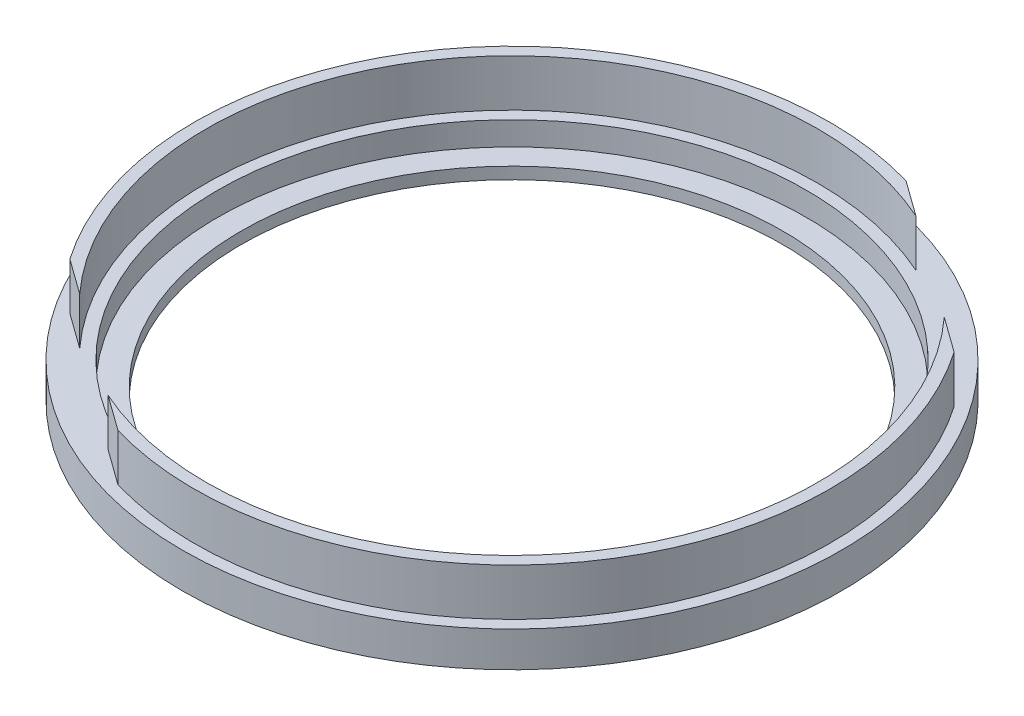
ISO-10303-21;
HEADER;
FILE_DESCRIPTION(('STEP AP214'),'2;1');
FILE_NAME('part.step','',(''),(''),'','','');
FILE_SCHEMA(('AUTOMOTIVE_DESIGN { 1 0 10303 214 1 1 1 1 }'));
ENDSEC;
DATA;
#1=APPLICATION_CONTEXT('core data for automotive mechanical design processes');
#2=APPLICATION_PROTOCOL_DEFINITION('international standard','automotive_design',2000,#1);
#3=PRODUCT_CONTEXT('',#1,'mechanical');
#4=PRODUCT('Part','Part','',(#3));
#5=PRODUCT_RELATED_PRODUCT_CATEGORY('part','',(#4));
#6=PRODUCT_DEFINITION_FORMATION('','',#4);
#7=PRODUCT_DEFINITION_CONTEXT('part definition',#1,'design');
#8=PRODUCT_DEFINITION('design','',#6,#7);
#9=PRODUCT_DEFINITION_SHAPE('','',#8);
#10=(LENGTH_UNIT() NAMED_UNIT(*) SI_UNIT(.MILLI.,.METRE.));
#11=(NAMED_UNIT(*) PLANE_ANGLE_UNIT() SI_UNIT($,.RADIAN.));
#12=(NAMED_UNIT(*) SI_UNIT($,.STERADIAN.) SOLID_ANGLE_UNIT());
#13=UNCERTAINTY_MEASURE_WITH_UNIT(LENGTH_MEASURE(1.E-05),#10,'distance_accuracy_value','');
#14=(GEOMETRIC_REPRESENTATION_CONTEXT(3) GLOBAL_UNCERTAINTY_ASSIGNED_CONTEXT((#13)) GLOBAL_UNIT_ASSIGNED_CONTEXT((#10,
#11,#12)) REPRESENTATION_CONTEXT('',''));
#15=CARTESIAN_POINT('',(0.,0.,0.));
#16=DIRECTION('',(0.,0.,1.));
#17=DIRECTION('',(1.,0.,0.));
#18=AXIS2_PLACEMENT_3D('',#15,#16,#17);
#19=CARTESIAN_POINT('',(-49.2601499183251,7.,-37.6292811876095));
#20=DIRECTION('',(0.,1.,0.));
#21=DIRECTION('',(0.,0.,1.));
#22=AXIS2_PLACEMENT_3D('',#19,#20,#21);
#23=PLANE('',#22);
#24=DIRECTION('',(-0.811044741779512,0.,-0.584984125281878));
#25=VECTOR('',#24,1.);
#26=CARTESIAN_POINT('',(-71.4689323117501,7.,-22.274477880452));
#27=LINE('',#26,#25);
#28=CARTESIAN_POINT('',(-56.8214642752121,7.,-11.7096645778613));
#29=VERTEX_POINT('',#28);
#30=CARTESIAN_POINT('',(-59.812298503221,7.,-13.8668705303912));
#31=VERTEX_POINT('',#30);
#32=EDGE_CURVE('E148',#29,#31,#27,.T.);
#33=ORIENTED_EDGE('',*,*,#32,.F.);
#34=CARTESIAN_POINT('',(-49.2601499183251,7.,-37.6292811876095));
#35=DIRECTION('',(0.,1.,0.));
#36=DIRECTION('',(0.,0.,1.));
#37=AXIS2_PLACEMENT_3D('',#34,#35,#36);
#38=CIRCLE('',#37,27.);
#39=CARTESIAN_POINT('',(-27.0513675249,7.,-52.9840844947669));
#40=VERTEX_POINT('',#39);
#41=EDGE_CURVE('E116',#29,#40,#38,.T.);
#42=ORIENTED_EDGE('',*,*,#41,.T.);
#43=DIRECTION('',(0.811044741779513,0.,0.584984125281877));
#44=VECTOR('',#43,1.);
#45=CARTESIAN_POINT('',(-41.698835561438,7.,-63.5488977973576));
#46=LINE('',#45,#44);
#47=CARTESIAN_POINT('',(-30.0422017529089,7.,-55.1412904472969));
#48=VERTEX_POINT('',#47);
#49=EDGE_CURVE('E146',#48,#40,#46,.T.);
#50=ORIENTED_EDGE('',*,*,#49,.F.);
#51=CARTESIAN_POINT('',(-49.2601499183251,7.,-37.6292811876095));
#52=DIRECTION('',(0.,1.,0.));
#53=DIRECTION('',(0.,0.,1.));
#54=AXIS2_PLACEMENT_3D('',#51,#52,#53);
#55=CIRCLE('',#54,26.);
#56=EDGE_CURVE('E127',#31,#48,#55,.T.);
#57=ORIENTED_EDGE('',*,*,#56,.F.);
#58=EDGE_LOOP('',(#33,#42,#50,#57));
#59=FACE_BOUND('',#58,.T.);
#60=ADVANCED_FACE('F35',(#59),#23,.T.);
#61=CARTESIAN_POINT('',(-49.2601499183251,7.,-37.6292811876095));
#62=DIRECTION('',(0.,-1.,0.));
#63=DIRECTION('',(0.,0.,-1.));
#64=AXIS2_PLACEMENT_3D('',#61,#62,#63);
#65=CYLINDRICAL_SURFACE('',#64,27.);
#66=CARTESIAN_POINT('',(-49.2601499183251,3.,-37.6292811876095));
#67=DIRECTION('',(0.,1.,0.));
#68=DIRECTION('',(0.,0.,1.));
#69=AXIS2_PLACEMENT_3D('',#66,#67,#68);
#70=CIRCLE('',#69,27.);
#71=CARTESIAN_POINT('',(-41.698835561438,3.,-63.5488977973576));
#72=VERTEX_POINT('',#71);
#73=CARTESIAN_POINT('',(-71.4689323117501,3.,-22.274477880452));
#74=VERTEX_POINT('',#73);
#75=EDGE_CURVE('E122',#72,#74,#70,.T.);
#76=ORIENTED_EDGE('',*,*,#75,.T.);
#77=DIRECTION('',(0.,1.,0.));
#78=VECTOR('',#77,1.);
#79=CARTESIAN_POINT('',(-71.4689323117501,3.,-22.274477880452));
#80=LINE('',#79,#78);
#81=CARTESIAN_POINT('',(-71.4689323117501,7.,-22.274477880452));
#82=VERTEX_POINT('',#81);
#83=EDGE_CURVE('E117',#74,#82,#80,.T.);
#84=ORIENTED_EDGE('',*,*,#83,.T.);
#85=CARTESIAN_POINT('',(-41.698835561438,7.,-63.5488977973576));
#86=VERTEX_POINT('',#85);
#87=EDGE_CURVE('E135',#86,#82,#38,.T.);
#88=ORIENTED_EDGE('',*,*,#87,.F.);
#89=DIRECTION('',(0.,1.,0.));
#90=VECTOR('',#89,1.);
#91=CARTESIAN_POINT('',(-41.698835561438,3.,-63.5488977973576));
#92=LINE('',#91,#90);
#93=EDGE_CURVE('E157',#72,#86,#92,.T.);
#94=ORIENTED_EDGE('',*,*,#93,.F.);
#95=EDGE_LOOP('',(#76,#84,#88,#94));
#96=FACE_BOUND('',#95,.T.);
#97=ADVANCED_FACE('F197',(#96),#65,.T.);
#98=CARTESIAN_POINT('',(-49.2601499183251,7.,-37.6292811876095));
#99=DIRECTION('',(0.,-1.,0.));
#100=DIRECTION('',(0.,0.,-1.));
#101=AXIS2_PLACEMENT_3D('',#98,#99,#100);
#102=CYLINDRICAL_SURFACE('',#101,26.);
#103=DIRECTION('',(0.,-1.,0.));
#104=VECTOR('',#103,1.);
#105=CARTESIAN_POINT('',(-59.812298503221,7.,-13.8668705303912));
#106=LINE('',#105,#104);
#107=CARTESIAN_POINT('',(-59.812298503221,3.,-13.8668705303912));
#108=VERTEX_POINT('',#107);
#109=EDGE_CURVE('E105',#31,#108,#106,.T.);
#110=ORIENTED_EDGE('',*,*,#109,.F.);
#111=ORIENTED_EDGE('',*,*,#56,.T.);
#112=DIRECTION('',(0.,-1.,0.));
#113=VECTOR('',#112,1.);
#114=CARTESIAN_POINT('',(-30.0422017529089,7.,-55.1412904472969));
#115=LINE('',#114,#113);
#116=CARTESIAN_POINT('',(-30.0422017529089,3.,-55.1412904472969));
#117=VERTEX_POINT('',#116);
#118=EDGE_CURVE('E154',#117,#48,#115,.F.);
#119=ORIENTED_EDGE('',*,*,#118,.F.);
#120=CARTESIAN_POINT('',(-49.2601499183251,3.,-37.6292811876095));
#121=DIRECTION('',(0.,1.,0.));
#122=DIRECTION('',(0.,0.,1.));
#123=AXIS2_PLACEMENT_3D('',#120,#121,#122);
#124=CIRCLE('',#123,26.);
#125=EDGE_CURVE('E39',#117,#108,#124,.F.);
#126=ORIENTED_EDGE('',*,*,#125,.T.);
#127=EDGE_LOOP('',(#110,#111,#119,#126));
#128=FACE_BOUND('',#127,.T.);
#129=ADVANCED_FACE('F181',(#128),#102,.F.);
#130=CARTESIAN_POINT('',(-49.2601499183251,3.,-37.6292811876095));
#131=DIRECTION('',(0.,-1.,0.));
#132=DIRECTION('',(0.,0.,-1.));
#133=AXIS2_PLACEMENT_3D('',#130,#131,#132);
#134=CYLINDRICAL_SURFACE('',#133,28.);
#135=CARTESIAN_POINT('',(-49.2601499183251,3.,-37.6292811876095));
#136=DIRECTION('',(0.,1.,0.));
#137=DIRECTION('',(0.,0.,1.));
#138=AXIS2_PLACEMENT_3D('',#135,#136,#137);
#139=CIRCLE('',#138,28.);
#140=CARTESIAN_POINT('',(-49.2601499183251,3.,-9.62928118760946));
#141=VERTEX_POINT('',#140);
#142=EDGE_CURVE('E131',#141,#141,#139,.T.);
#143=ORIENTED_EDGE('',*,*,#142,.F.);
#144=EDGE_LOOP('',(#143));
#145=FACE_BOUND('',#144,.T.);
#146=CARTESIAN_POINT('',(-49.2601499183251,0.,-37.6292811876095));
#147=DIRECTION('',(0.,1.,0.));
#148=DIRECTION('',(0.,0.,1.));
#149=AXIS2_PLACEMENT_3D('',#146,#147,#148);
#150=CIRCLE('',#149,28.);
#151=CARTESIAN_POINT('',(-49.2601499183251,0.,-9.62928118760946));
#152=VERTEX_POINT('',#151);
#153=EDGE_CURVE('E133',#152,#152,#150,.T.);
#154=ORIENTED_EDGE('',*,*,#153,.T.);
#155=EDGE_LOOP('',(#154));
#156=FACE_BOUND('',#155,.T.);
#157=ADVANCED_FACE('F37',(#145,#156),#134,.T.);
#158=CARTESIAN_POINT('',(-49.2601499183251,3.,-37.6292811876095));
#159=DIRECTION('',(0.,1.,0.));
#160=DIRECTION('',(0.,0.,1.));
#161=AXIS2_PLACEMENT_3D('',#158,#159,#160);
#162=PLANE('',#161);
#163=ORIENTED_EDGE('',*,*,#142,.T.);
#164=EDGE_LOOP('',(#163));
#165=FACE_BOUND('',#164,.T.);
#166=CARTESIAN_POINT('',(-56.8214642752121,3.,-11.7096645778613));
#167=VERTEX_POINT('',#166);
#168=CARTESIAN_POINT('',(-27.0513675249,3.,-52.9840844947669));
#169=VERTEX_POINT('',#168);
#170=EDGE_CURVE('E114',#167,#169,#70,.T.);
#171=ORIENTED_EDGE('',*,*,#170,.F.);
#172=DIRECTION('',(-0.811044741779512,0.,-0.584984125281878));
#173=VECTOR('',#172,1.);
#174=CARTESIAN_POINT('',(-71.4689323117501,3.,-22.274477880452));
#175=LINE('',#174,#173);
#176=EDGE_CURVE('E58',#167,#108,#175,.T.);
#177=ORIENTED_EDGE('',*,*,#176,.T.);
#178=ORIENTED_EDGE('',*,*,#125,.F.);
#179=DIRECTION('',(0.811044741779513,0.,0.584984125281877));
#180=VECTOR('',#179,1.);
#181=CARTESIAN_POINT('',(-41.698835561438,3.,-63.5488977973576));
#182=LINE('',#181,#180);
#183=EDGE_CURVE('E120',#117,#169,#182,.T.);
#184=ORIENTED_EDGE('',*,*,#183,.T.);
#185=EDGE_LOOP('',(#171,#177,#178,#184));
#186=FACE_BOUND('',#185,.T.);
#187=CARTESIAN_POINT('',(-68.4780980837412,3.,-20.1172719279221));
#188=VERTEX_POINT('',#187);
#189=EDGE_CURVE('E107',#188,#74,#175,.T.);
#190=ORIENTED_EDGE('',*,*,#189,.T.);
#191=ORIENTED_EDGE('',*,*,#75,.F.);
#192=CARTESIAN_POINT('',(-38.7080013334292,3.,-61.3916918448277));
#193=VERTEX_POINT('',#192);
#194=EDGE_CURVE('E50',#72,#193,#182,.T.);
#195=ORIENTED_EDGE('',*,*,#194,.T.);
#196=EDGE_CURVE('E11',#188,#193,#124,.F.);
#197=ORIENTED_EDGE('',*,*,#196,.F.);
#198=EDGE_LOOP('',(#190,#191,#195,#197));
#199=FACE_BOUND('',#198,.T.);
#200=CARTESIAN_POINT('',(-49.2601499183251,3.,-37.6292811876095));
#201=DIRECTION('',(0.,1.,0.));
#202=DIRECTION('',(0.,0.,1.));
#203=AXIS2_PLACEMENT_3D('',#200,#201,#202);
#204=CIRCLE('',#203,25.);
#205=CARTESIAN_POINT('',(-49.2601499183251,3.,-12.6292811876095));
#206=VERTEX_POINT('',#205);
#207=EDGE_CURVE('E172',#206,#206,#204,.T.);
#208=ORIENTED_EDGE('',*,*,#207,.F.);
#209=EDGE_LOOP('',(#208));
#210=FACE_BOUND('',#209,.T.);
#211=ADVANCED_FACE('F119',(#165,#186,#199,#210),#162,.T.);
#212=CARTESIAN_POINT('',(-49.2601499183251,0.,-37.6292811876095));
#213=DIRECTION('',(0.,1.,0.));
#214=DIRECTION('',(0.,0.,1.));
#215=AXIS2_PLACEMENT_3D('',#212,#213,#214);
#216=PLANE('',#215);
#217=CARTESIAN_POINT('',(-49.2601499183251,0.,-37.6292811876095));
#218=DIRECTION('',(0.,1.,0.));
#219=DIRECTION('',(0.,0.,1.));
#220=AXIS2_PLACEMENT_3D('',#217,#218,#219);
#221=CIRCLE('',#220,23.);
#222=CARTESIAN_POINT('',(-49.2601499183251,0.,-14.6292811876095));
#223=VERTEX_POINT('',#222);
#224=EDGE_CURVE('E169',#223,#223,#221,.T.);
#225=ORIENTED_EDGE('',*,*,#224,.T.);
#226=EDGE_LOOP('',(#225));
#227=FACE_BOUND('',#226,.T.);
#228=ORIENTED_EDGE('',*,*,#153,.F.);
#229=EDGE_LOOP('',(#228));
#230=FACE_BOUND('',#229,.T.);
#231=ADVANCED_FACE('F207',(#227,#230),#216,.F.);
#232=CARTESIAN_POINT('',(-68.4780980837412,7.,-20.1172719279221));
#233=VERTEX_POINT('',#232);
#234=EDGE_CURVE('E149',#233,#82,#27,.T.);
#235=ORIENTED_EDGE('',*,*,#234,.F.);
#236=CARTESIAN_POINT('',(-38.7080013334292,7.,-61.3916918448277));
#237=VERTEX_POINT('',#236);
#238=EDGE_CURVE('E123',#237,#233,#55,.T.);
#239=ORIENTED_EDGE('',*,*,#238,.F.);
#240=EDGE_CURVE('E158',#86,#237,#46,.T.);
#241=ORIENTED_EDGE('',*,*,#240,.F.);
#242=ORIENTED_EDGE('',*,*,#87,.T.);
#243=EDGE_LOOP('',(#235,#239,#241,#242));
#244=FACE_BOUND('',#243,.T.);
#245=ADVANCED_FACE('F199',(#244),#23,.T.);
#246=ORIENTED_EDGE('',*,*,#41,.F.);
#247=DIRECTION('',(0.,1.,0.));
#248=VECTOR('',#247,1.);
#249=CARTESIAN_POINT('',(-56.8214642752121,3.,-11.7096645778613));
#250=LINE('',#249,#248);
#251=EDGE_CURVE('E102',#167,#29,#250,.T.);
#252=ORIENTED_EDGE('',*,*,#251,.F.);
#253=ORIENTED_EDGE('',*,*,#170,.T.);
#254=DIRECTION('',(0.,1.,0.));
#255=VECTOR('',#254,1.);
#256=CARTESIAN_POINT('',(-27.0513675249,3.,-52.9840844947669));
#257=LINE('',#256,#255);
#258=EDGE_CURVE('E151',#169,#40,#257,.T.);
#259=ORIENTED_EDGE('',*,*,#258,.T.);
#260=EDGE_LOOP('',(#246,#252,#253,#259));
#261=FACE_BOUND('',#260,.T.);
#262=ADVANCED_FACE('F112',(#261),#65,.T.);
#263=DIRECTION('',(0.,-1.,0.));
#264=VECTOR('',#263,1.);
#265=CARTESIAN_POINT('',(-68.4780980837412,7.,-20.1172719279221));
#266=LINE('',#265,#264);
#267=EDGE_CURVE('E165',#188,#233,#266,.F.);
#268=ORIENTED_EDGE('',*,*,#267,.F.);
#269=ORIENTED_EDGE('',*,*,#196,.T.);
#270=DIRECTION('',(0.,-1.,0.));
#271=VECTOR('',#270,1.);
#272=CARTESIAN_POINT('',(-38.7080013334292,7.,-61.3916918448277));
#273=LINE('',#272,#271);
#274=EDGE_CURVE('E163',#237,#193,#273,.T.);
#275=ORIENTED_EDGE('',*,*,#274,.F.);
#276=ORIENTED_EDGE('',*,*,#238,.T.);
#277=EDGE_LOOP('',(#268,#269,#275,#276));
#278=FACE_BOUND('',#277,.T.);
#279=ADVANCED_FACE('F212',(#278),#102,.F.);
#280=CARTESIAN_POINT('',(-49.2601499183251,1.,-37.6292811876095));
#281=DIRECTION('',(0.,1.,0.));
#282=DIRECTION('',(0.,0.,1.));
#283=AXIS2_PLACEMENT_3D('',#280,#281,#282);
#284=CYLINDRICAL_SURFACE('',#283,25.);
#285=CARTESIAN_POINT('',(-49.2601499183251,1.,-37.6292811876095));
#286=DIRECTION('',(0.,1.,0.));
#287=DIRECTION('',(0.,0.,1.));
#288=AXIS2_PLACEMENT_3D('',#285,#286,#287);
#289=CIRCLE('',#288,25.);
#290=CARTESIAN_POINT('',(-49.2601499183251,1.,-12.6292811876095));
#291=VERTEX_POINT('',#290);
#292=EDGE_CURVE('E175',#291,#291,#289,.T.);
#293=ORIENTED_EDGE('',*,*,#292,.F.);
#294=EDGE_LOOP('',(#293));
#295=FACE_BOUND('',#294,.T.);
#296=ORIENTED_EDGE('',*,*,#207,.T.);
#297=EDGE_LOOP('',(#296));
#298=FACE_BOUND('',#297,.T.);
#299=ADVANCED_FACE('F227',(#295,#298),#284,.F.);
#300=CARTESIAN_POINT('',(-49.2601499183251,1.,-37.6292811876095));
#301=DIRECTION('',(0.,1.,0.));
#302=DIRECTION('',(0.,0.,1.));
#303=AXIS2_PLACEMENT_3D('',#300,#301,#302);
#304=PLANE('',#303);
#305=CARTESIAN_POINT('',(-49.2601499183251,1.,-37.6292811876095));
#306=DIRECTION('',(0.,1.,0.));
#307=DIRECTION('',(0.,0.,1.));
#308=AXIS2_PLACEMENT_3D('',#305,#306,#307);
#309=CIRCLE('',#308,23.);
#310=CARTESIAN_POINT('',(-49.2601499183251,1.,-14.6292811876095));
#311=VERTEX_POINT('',#310);
#312=EDGE_CURVE('E168',#311,#311,#309,.T.);
#313=ORIENTED_EDGE('',*,*,#312,.F.);
#314=EDGE_LOOP('',(#313));
#315=FACE_BOUND('',#314,.T.);
#316=ORIENTED_EDGE('',*,*,#292,.T.);
#317=EDGE_LOOP('',(#316));
#318=FACE_BOUND('',#317,.T.);
#319=ADVANCED_FACE('F229',(#315,#318),#304,.T.);
#320=CARTESIAN_POINT('',(-49.2601499183251,0.,-37.6292811876095));
#321=DIRECTION('',(0.,1.,0.));
#322=DIRECTION('',(0.,0.,1.));
#323=AXIS2_PLACEMENT_3D('',#320,#321,#322);
#324=CYLINDRICAL_SURFACE('',#323,23.);
#325=ORIENTED_EDGE('',*,*,#224,.F.);
#326=EDGE_LOOP('',(#325));
#327=FACE_BOUND('',#326,.T.);
#328=ORIENTED_EDGE('',*,*,#312,.T.);
#329=EDGE_LOOP('',(#328));
#330=FACE_BOUND('',#329,.T.);
#331=ADVANCED_FACE('F193',(#327,#330),#324,.F.);
#332=CARTESIAN_POINT('',(-41.698835561438,3.,-63.5488977973576));
#333=DIRECTION('',(-0.584984125281877,0.,0.811044741779513));
#334=DIRECTION('',(0.811044741779513,0.,0.584984125281877));
#335=AXIS2_PLACEMENT_3D('',#332,#333,#334);
#336=PLANE('',#335);
#337=ORIENTED_EDGE('',*,*,#274,.T.);
#338=ORIENTED_EDGE('',*,*,#194,.F.);
#339=ORIENTED_EDGE('',*,*,#93,.T.);
#340=ORIENTED_EDGE('',*,*,#240,.T.);
#341=EDGE_LOOP('',(#337,#338,#339,#340));
#342=FACE_BOUND('',#341,.T.);
#343=ADVANCED_FACE('F185',(#342),#336,.F.);
#344=ORIENTED_EDGE('',*,*,#118,.T.);
#345=ORIENTED_EDGE('',*,*,#49,.T.);
#346=ORIENTED_EDGE('',*,*,#258,.F.);
#347=ORIENTED_EDGE('',*,*,#183,.F.);
#348=EDGE_LOOP('',(#344,#345,#346,#347));
#349=FACE_BOUND('',#348,.T.);
#350=ADVANCED_FACE('F183',(#349),#336,.F.);
#351=CARTESIAN_POINT('',(-71.4689323117501,3.,-22.274477880452));
#352=DIRECTION('',(0.584984125281878,0.,-0.811044741779512));
#353=DIRECTION('',(-0.811044741779512,0.,-0.584984125281878));
#354=AXIS2_PLACEMENT_3D('',#351,#352,#353);
#355=PLANE('',#354);
#356=ORIENTED_EDGE('',*,*,#109,.T.);
#357=ORIENTED_EDGE('',*,*,#176,.F.);
#358=ORIENTED_EDGE('',*,*,#251,.T.);
#359=ORIENTED_EDGE('',*,*,#32,.T.);
#360=EDGE_LOOP('',(#356,#357,#358,#359));
#361=FACE_BOUND('',#360,.T.);
#362=ADVANCED_FACE('F101',(#361),#355,.F.);
#363=ORIENTED_EDGE('',*,*,#267,.T.);
#364=ORIENTED_EDGE('',*,*,#234,.T.);
#365=ORIENTED_EDGE('',*,*,#83,.F.);
#366=ORIENTED_EDGE('',*,*,#189,.F.);
#367=EDGE_LOOP('',(#363,#364,#365,#366));
#368=FACE_BOUND('',#367,.T.);
#369=ADVANCED_FACE('F191',(#368),#355,.F.);
#370=CLOSED_SHELL('',(#60,#97,#129,#157,#211,#231,#245,#262,#279,#299,#319,#331,#343,#350,#362,#369));
#371=MANIFOLD_SOLID_BREP('B2',#370);
#372=ADVANCED_BREP_SHAPE_REPRESENTATION('',(#18,#371),#14);
#373=SHAPE_DEFINITION_REPRESENTATION(#9,#372);
ENDSEC;
END-ISO-10303-21;
